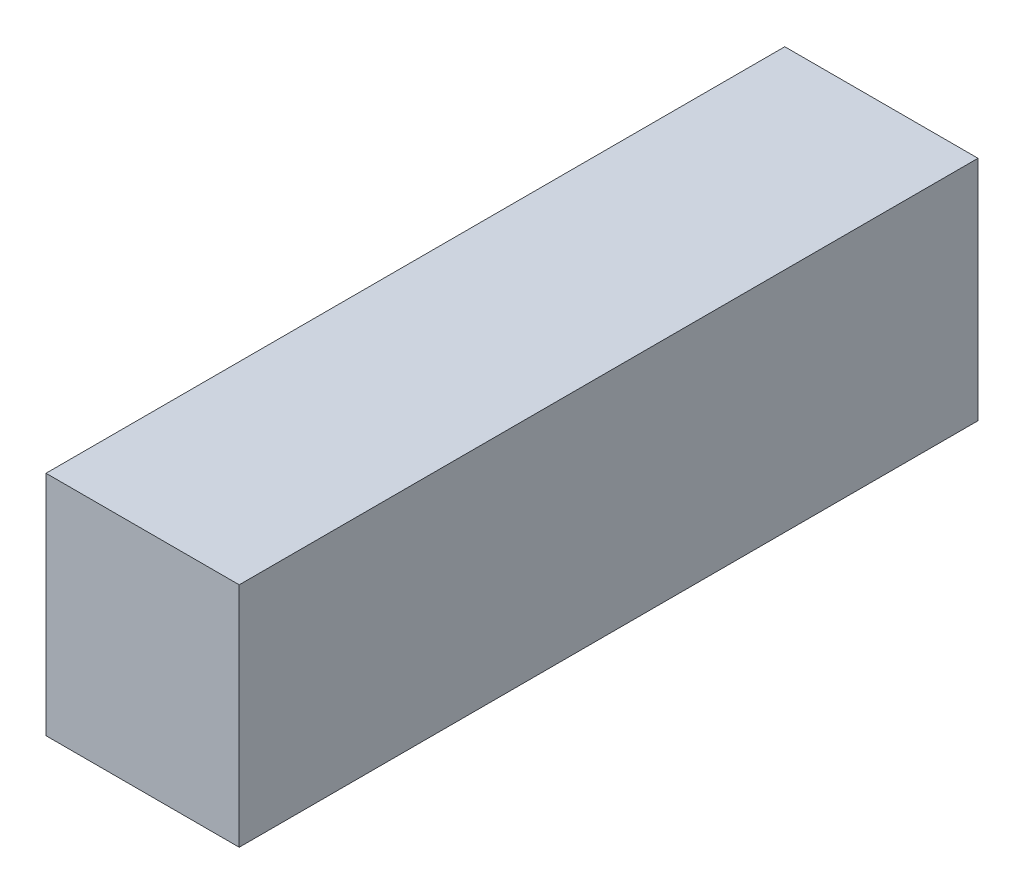
ISO-10303-21;
HEADER;
FILE_DESCRIPTION(('STEP AP214'),'2;1');
FILE_NAME('part.step','',(''),(''),'','','');
FILE_SCHEMA(('AUTOMOTIVE_DESIGN { 1 0 10303 214 1 1 1 1 }'));
ENDSEC;
DATA;
#1=APPLICATION_CONTEXT('core data for automotive mechanical design processes');
#2=APPLICATION_PROTOCOL_DEFINITION('international standard','automotive_design',2000,#1);
#3=PRODUCT_CONTEXT('',#1,'mechanical');
#4=PRODUCT('Part','Part','',(#3));
#5=PRODUCT_RELATED_PRODUCT_CATEGORY('part','',(#4));
#6=PRODUCT_DEFINITION_FORMATION('','',#4);
#7=PRODUCT_DEFINITION_CONTEXT('part definition',#1,'design');
#8=PRODUCT_DEFINITION('design','',#6,#7);
#9=PRODUCT_DEFINITION_SHAPE('','',#8);
#10=(LENGTH_UNIT() NAMED_UNIT(*) SI_UNIT(.MILLI.,.METRE.));
#11=(NAMED_UNIT(*) PLANE_ANGLE_UNIT() SI_UNIT($,.RADIAN.));
#12=(NAMED_UNIT(*) SI_UNIT($,.STERADIAN.) SOLID_ANGLE_UNIT());
#13=UNCERTAINTY_MEASURE_WITH_UNIT(LENGTH_MEASURE(1.E-05),#10,'distance_accuracy_value','');
#14=(GEOMETRIC_REPRESENTATION_CONTEXT(3) GLOBAL_UNCERTAINTY_ASSIGNED_CONTEXT((#13)) GLOBAL_UNIT_ASSIGNED_CONTEXT((#10,
#11,#12)) REPRESENTATION_CONTEXT('',''));
#15=CARTESIAN_POINT('',(0.,0.,0.));
#16=DIRECTION('',(0.,0.,1.));
#17=DIRECTION('',(1.,0.,0.));
#18=AXIS2_PLACEMENT_3D('',#15,#16,#17);
#19=CARTESIAN_POINT('',(8.5,-10.,32.5));
#20=DIRECTION('',(-1.,0.,0.));
#21=DIRECTION('',(0.,0.,1.));
#22=AXIS2_PLACEMENT_3D('',#19,#20,#21);
#23=PLANE('',#22);
#24=DIRECTION('',(0.,1.,0.));
#25=VECTOR('',#24,1.);
#26=CARTESIAN_POINT('',(8.5,-10.,-32.5));
#27=LINE('',#26,#25);
#28=CARTESIAN_POINT('',(8.5,-10.,-32.5));
#29=VERTEX_POINT('',#28);
#30=CARTESIAN_POINT('',(8.5,10.,-32.5));
#31=VERTEX_POINT('',#30);
#32=EDGE_CURVE('E113',#29,#31,#27,.T.);
#33=ORIENTED_EDGE('',*,*,#32,.T.);
#34=DIRECTION('',(0.,0.,-1.));
#35=VECTOR('',#34,1.);
#36=CARTESIAN_POINT('',(8.5,10.,32.5));
#37=LINE('',#36,#35);
#38=CARTESIAN_POINT('',(8.5,10.,32.5));
#39=VERTEX_POINT('',#38);
#40=EDGE_CURVE('E11',#39,#31,#37,.T.);
#41=ORIENTED_EDGE('',*,*,#40,.F.);
#42=DIRECTION('',(0.,1.,0.));
#43=VECTOR('',#42,1.);
#44=CARTESIAN_POINT('',(8.5,-10.,32.5));
#45=LINE('',#44,#43);
#46=CARTESIAN_POINT('',(8.5,-10.,32.5));
#47=VERTEX_POINT('',#46);
#48=EDGE_CURVE('E97',#47,#39,#45,.T.);
#49=ORIENTED_EDGE('',*,*,#48,.F.);
#50=DIRECTION('',(0.,0.,-1.));
#51=VECTOR('',#50,1.);
#52=CARTESIAN_POINT('',(8.5,-10.,32.5));
#53=LINE('',#52,#51);
#54=EDGE_CURVE('E109',#47,#29,#53,.T.);
#55=ORIENTED_EDGE('',*,*,#54,.T.);
#56=EDGE_LOOP('',(#33,#41,#49,#55));
#57=FACE_BOUND('',#56,.T.);
#58=ADVANCED_FACE('F45',(#57),#23,.F.);
#59=CARTESIAN_POINT('',(-8.5,10.,32.5));
#60=DIRECTION('',(0.,-1.,0.));
#61=DIRECTION('',(0.,0.,-1.));
#62=AXIS2_PLACEMENT_3D('',#59,#60,#61);
#63=PLANE('',#62);
#64=DIRECTION('',(-1.,0.,0.));
#65=VECTOR('',#64,1.);
#66=CARTESIAN_POINT('',(-8.5,10.,-32.5));
#67=LINE('',#66,#65);
#68=CARTESIAN_POINT('',(-8.5,10.,-32.5));
#69=VERTEX_POINT('',#68);
#70=EDGE_CURVE('E102',#31,#69,#67,.T.);
#71=ORIENTED_EDGE('',*,*,#70,.T.);
#72=DIRECTION('',(0.,0.,-1.));
#73=VECTOR('',#72,1.);
#74=CARTESIAN_POINT('',(-8.5,10.,32.5));
#75=LINE('',#74,#73);
#76=CARTESIAN_POINT('',(-8.5,10.,32.5));
#77=VERTEX_POINT('',#76);
#78=EDGE_CURVE('E54',#77,#69,#75,.T.);
#79=ORIENTED_EDGE('',*,*,#78,.F.);
#80=DIRECTION('',(-1.,0.,0.));
#81=VECTOR('',#80,1.);
#82=CARTESIAN_POINT('',(-8.5,10.,32.5));
#83=LINE('',#82,#81);
#84=EDGE_CURVE('E92',#39,#77,#83,.T.);
#85=ORIENTED_EDGE('',*,*,#84,.F.);
#86=ORIENTED_EDGE('',*,*,#40,.T.);
#87=EDGE_LOOP('',(#71,#79,#85,#86));
#88=FACE_BOUND('',#87,.T.);
#89=ADVANCED_FACE('F101',(#88),#63,.F.);
#90=CARTESIAN_POINT('',(-8.5,-10.,32.5));
#91=DIRECTION('',(1.,0.,0.));
#92=DIRECTION('',(0.,0.,-1.));
#93=AXIS2_PLACEMENT_3D('',#90,#91,#92);
#94=PLANE('',#93);
#95=DIRECTION('',(0.,-1.,0.));
#96=VECTOR('',#95,1.);
#97=CARTESIAN_POINT('',(-8.5,-10.,-32.5));
#98=LINE('',#97,#96);
#99=CARTESIAN_POINT('',(-8.5,-10.,-32.5));
#100=VERTEX_POINT('',#99);
#101=EDGE_CURVE('E79',#69,#100,#98,.T.);
#102=ORIENTED_EDGE('',*,*,#101,.T.);
#103=DIRECTION('',(0.,0.,-1.));
#104=VECTOR('',#103,1.);
#105=CARTESIAN_POINT('',(-8.5,-10.,32.5));
#106=LINE('',#105,#104);
#107=CARTESIAN_POINT('',(-8.5,-10.,32.5));
#108=VERTEX_POINT('',#107);
#109=EDGE_CURVE('E104',#108,#100,#106,.T.);
#110=ORIENTED_EDGE('',*,*,#109,.F.);
#111=DIRECTION('',(0.,-1.,0.));
#112=VECTOR('',#111,1.);
#113=CARTESIAN_POINT('',(-8.5,-10.,32.5));
#114=LINE('',#113,#112);
#115=EDGE_CURVE('E95',#77,#108,#114,.T.);
#116=ORIENTED_EDGE('',*,*,#115,.F.);
#117=ORIENTED_EDGE('',*,*,#78,.T.);
#118=EDGE_LOOP('',(#102,#110,#116,#117));
#119=FACE_BOUND('',#118,.T.);
#120=ADVANCED_FACE('F105',(#119),#94,.F.);
#121=CARTESIAN_POINT('',(-8.5,-10.,32.5));
#122=DIRECTION('',(0.,1.,0.));
#123=DIRECTION('',(0.,0.,1.));
#124=AXIS2_PLACEMENT_3D('',#121,#122,#123);
#125=PLANE('',#124);
#126=DIRECTION('',(1.,0.,0.));
#127=VECTOR('',#126,1.);
#128=CARTESIAN_POINT('',(-8.5,-10.,-32.5));
#129=LINE('',#128,#127);
#130=EDGE_CURVE('E85',#100,#29,#129,.T.);
#131=ORIENTED_EDGE('',*,*,#130,.T.);
#132=ORIENTED_EDGE('',*,*,#54,.F.);
#133=DIRECTION('',(1.,0.,0.));
#134=VECTOR('',#133,1.);
#135=CARTESIAN_POINT('',(-8.5,-10.,32.5));
#136=LINE('',#135,#134);
#137=EDGE_CURVE('E62',#108,#47,#136,.T.);
#138=ORIENTED_EDGE('',*,*,#137,.F.);
#139=ORIENTED_EDGE('',*,*,#109,.T.);
#140=EDGE_LOOP('',(#131,#132,#138,#139));
#141=FACE_BOUND('',#140,.T.);
#142=ADVANCED_FACE('F126',(#141),#125,.F.);
#143=CARTESIAN_POINT('',(0.,0.,32.5));
#144=DIRECTION('',(0.,0.,-1.));
#145=DIRECTION('',(-1.,0.,0.));
#146=AXIS2_PLACEMENT_3D('',#143,#144,#145);
#147=PLANE('',#146);
#148=ORIENTED_EDGE('',*,*,#48,.T.);
#149=ORIENTED_EDGE('',*,*,#84,.T.);
#150=ORIENTED_EDGE('',*,*,#115,.T.);
#151=ORIENTED_EDGE('',*,*,#137,.T.);
#152=EDGE_LOOP('',(#148,#149,#150,#151));
#153=FACE_BOUND('',#152,.T.);
#154=ADVANCED_FACE('F93',(#153),#147,.F.);
#155=CARTESIAN_POINT('',(0.,0.,-32.5));
#156=DIRECTION('',(0.,0.,-1.));
#157=DIRECTION('',(-1.,0.,0.));
#158=AXIS2_PLACEMENT_3D('',#155,#156,#157);
#159=PLANE('',#158);
#160=ORIENTED_EDGE('',*,*,#32,.F.);
#161=ORIENTED_EDGE('',*,*,#130,.F.);
#162=ORIENTED_EDGE('',*,*,#101,.F.);
#163=ORIENTED_EDGE('',*,*,#70,.F.);
#164=EDGE_LOOP('',(#160,#161,#162,#163));
#165=FACE_BOUND('',#164,.T.);
#166=ADVANCED_FACE('F129',(#165),#159,.T.);
#167=CLOSED_SHELL('',(#58,#89,#120,#142,#154,#166));
#168=MANIFOLD_SOLID_BREP('B2',#167);
#169=ADVANCED_BREP_SHAPE_REPRESENTATION('',(#18,#168),#14);
#170=SHAPE_DEFINITION_REPRESENTATION(#9,#169);
ENDSEC;
END-ISO-10303-21;
